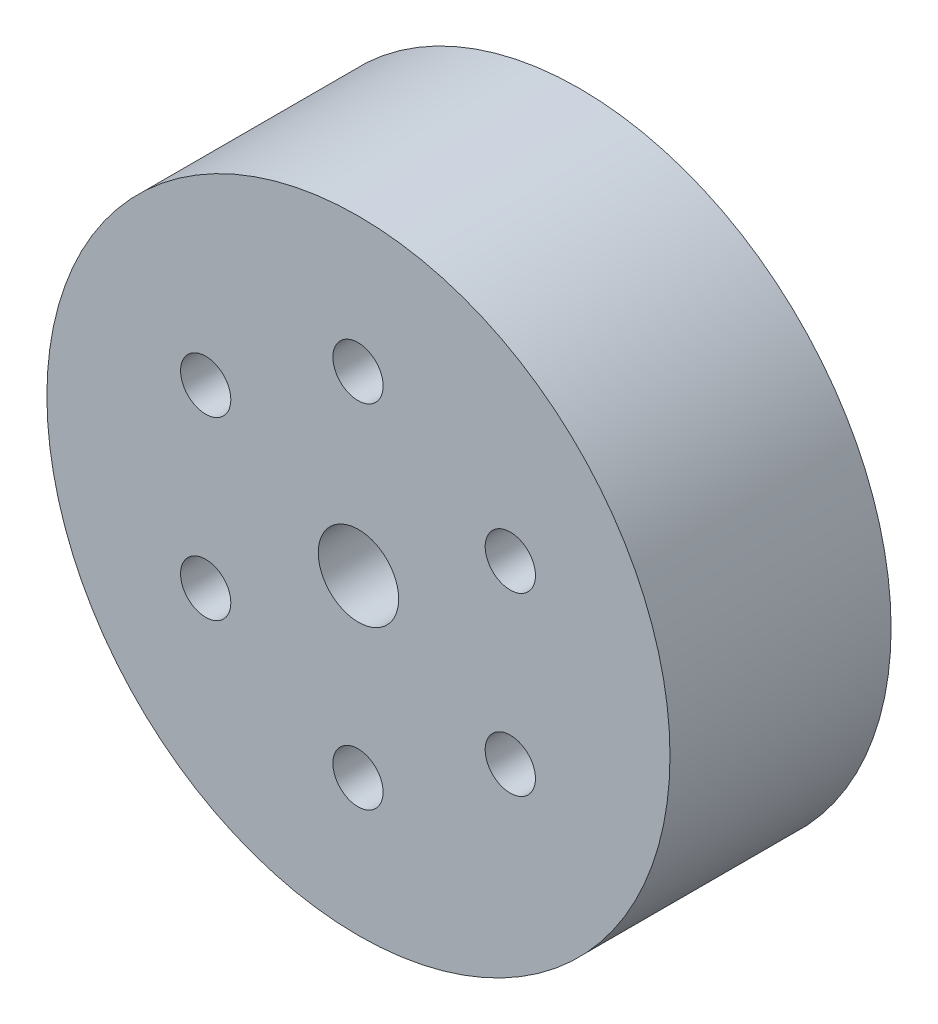
ISO-10303-21;
HEADER;
FILE_DESCRIPTION(('STEP AP214'),'2;1');
FILE_NAME('part.step','',(''),(''),'','','');
FILE_SCHEMA(('AUTOMOTIVE_DESIGN { 1 0 10303 214 1 1 1 1 }'));
ENDSEC;
DATA;
#1=APPLICATION_CONTEXT('core data for automotive mechanical design processes');
#2=APPLICATION_PROTOCOL_DEFINITION('international standard','automotive_design',2000,#1);
#3=PRODUCT_CONTEXT('',#1,'mechanical');
#4=PRODUCT('Part','Part','',(#3));
#5=PRODUCT_RELATED_PRODUCT_CATEGORY('part','',(#4));
#6=PRODUCT_DEFINITION_FORMATION('','',#4);
#7=PRODUCT_DEFINITION_CONTEXT('part definition',#1,'design');
#8=PRODUCT_DEFINITION('design','',#6,#7);
#9=PRODUCT_DEFINITION_SHAPE('','',#8);
#10=(LENGTH_UNIT() NAMED_UNIT(*) SI_UNIT(.MILLI.,.METRE.));
#11=(NAMED_UNIT(*) PLANE_ANGLE_UNIT() SI_UNIT($,.RADIAN.));
#12=(NAMED_UNIT(*) SI_UNIT($,.STERADIAN.) SOLID_ANGLE_UNIT());
#13=UNCERTAINTY_MEASURE_WITH_UNIT(LENGTH_MEASURE(1.E-05),#10,'distance_accuracy_value','');
#14=(GEOMETRIC_REPRESENTATION_CONTEXT(3) GLOBAL_UNCERTAINTY_ASSIGNED_CONTEXT((#13)) GLOBAL_UNIT_ASSIGNED_CONTEXT((#10,
#11,#12)) REPRESENTATION_CONTEXT('',''));
#15=CARTESIAN_POINT('',(0.,0.,0.));
#16=DIRECTION('',(0.,0.,1.));
#17=DIRECTION('',(1.,0.,0.));
#18=AXIS2_PLACEMENT_3D('',#15,#16,#17);
#19=CARTESIAN_POINT('',(0.,0.,11.));
#20=DIRECTION('',(0.,0.,-1.));
#21=DIRECTION('',(-1.,0.,0.));
#22=AXIS2_PLACEMENT_3D('',#19,#20,#21);
#23=CYLINDRICAL_SURFACE('',#22,15.5);
#24=CARTESIAN_POINT('',(0.,0.,11.));
#25=DIRECTION('',(0.,0.,1.));
#26=DIRECTION('',(1.,0.,0.));
#27=AXIS2_PLACEMENT_3D('',#24,#25,#26);
#28=CIRCLE('',#27,15.5);
#29=CARTESIAN_POINT('',(15.5,0.,11.));
#30=VERTEX_POINT('',#29);
#31=EDGE_CURVE('E10',#30,#30,#28,.T.);
#32=ORIENTED_EDGE('',*,*,#31,.F.);
#33=EDGE_LOOP('',(#32));
#34=FACE_BOUND('',#33,.T.);
#35=CARTESIAN_POINT('',(0.,0.,0.));
#36=DIRECTION('',(0.,0.,1.));
#37=DIRECTION('',(1.,0.,0.));
#38=AXIS2_PLACEMENT_3D('',#35,#36,#37);
#39=CIRCLE('',#38,15.5);
#40=CARTESIAN_POINT('',(15.5,0.,0.));
#41=VERTEX_POINT('',#40);
#42=EDGE_CURVE('E40',#41,#41,#39,.T.);
#43=ORIENTED_EDGE('',*,*,#42,.T.);
#44=EDGE_LOOP('',(#43));
#45=FACE_BOUND('',#44,.T.);
#46=ADVANCED_FACE('F37',(#34,#45),#23,.T.);
#47=CARTESIAN_POINT('',(0.,0.,11.));
#48=DIRECTION('',(0.,0.,1.));
#49=DIRECTION('',(1.,0.,0.));
#50=AXIS2_PLACEMENT_3D('',#47,#48,#49);
#51=PLANE('',#50);
#52=CARTESIAN_POINT('',(7.55529817483224,4.41361184172063,11.));
#53=DIRECTION('',(0.,0.,1.));
#54=DIRECTION('',(1.,0.,0.));
#55=AXIS2_PLACEMENT_3D('',#52,#53,#54);
#56=CIRCLE('',#55,1.25);
#57=CARTESIAN_POINT('',(8.80529817483224,4.41361184172063,11.));
#58=VERTEX_POINT('',#57);
#59=EDGE_CURVE('E84',#58,#58,#56,.T.);
#60=ORIENTED_EDGE('',*,*,#59,.F.);
#61=EDGE_LOOP('',(#60));
#62=FACE_BOUND('',#61,.T.);
#63=CARTESIAN_POINT('',(7.55507908258958,-4.33638815553643,11.));
#64=DIRECTION('',(0.,0.,1.));
#65=DIRECTION('',(1.,0.,0.));
#66=AXIS2_PLACEMENT_3D('',#63,#64,#65);
#67=CIRCLE('',#66,1.24999999999992);
#68=CARTESIAN_POINT('',(8.8050790825895,-4.33638815553643,11.));
#69=VERTEX_POINT('',#68);
#70=EDGE_CURVE('E76',#69,#69,#67,.T.);
#71=ORIENTED_EDGE('',*,*,#70,.F.);
#72=EDGE_LOOP('',(#71));
#73=FACE_BOUND('',#72,.T.);
#74=CARTESIAN_POINT('',(-0.0227527442701449,-8.71119841471704,11.));
#75=DIRECTION('',(0.,0.,1.));
#76=DIRECTION('',(1.,0.,0.));
#77=AXIS2_PLACEMENT_3D('',#74,#75,#76);
#78=CIRCLE('',#77,1.24999999999966);
#79=CARTESIAN_POINT('',(1.22724725572951,-8.71119841471704,11.));
#80=VERTEX_POINT('',#79);
#81=EDGE_CURVE('E68',#80,#80,#78,.T.);
#82=ORIENTED_EDGE('',*,*,#81,.F.);
#83=EDGE_LOOP('',(#82));
#84=FACE_BOUND('',#83,.T.);
#85=CARTESIAN_POINT('',(-7.6003654788872,-4.33600867664058,11.));
#86=DIRECTION('',(0.,0.,1.));
#87=DIRECTION('',(1.,0.,0.));
#88=AXIS2_PLACEMENT_3D('',#85,#86,#87);
#89=CIRCLE('',#88,1.24999999999946);
#90=CARTESIAN_POINT('',(-6.35036547888773,-4.33600867664058,11.));
#91=VERTEX_POINT('',#90);
#92=EDGE_CURVE('E59',#91,#91,#89,.T.);
#93=ORIENTED_EDGE('',*,*,#92,.F.);
#94=EDGE_LOOP('',(#93));
#95=FACE_BOUND('',#94,.T.);
#96=CARTESIAN_POINT('',(-7.60014638664453,4.41399132061648,11.));
#97=DIRECTION('',(0.,0.,1.));
#98=DIRECTION('',(1.,0.,0.));
#99=AXIS2_PLACEMENT_3D('',#96,#97,#98);
#100=CIRCLE('',#99,1.24999999999955);
#101=CARTESIAN_POINT('',(-6.35014638664498,4.41399132061648,11.));
#102=VERTEX_POINT('',#101);
#103=EDGE_CURVE('E99',#102,#102,#100,.T.);
#104=ORIENTED_EDGE('',*,*,#103,.F.);
#105=EDGE_LOOP('',(#104));
#106=FACE_BOUND('',#105,.T.);
#107=CARTESIAN_POINT('',(-0.0223145597848123,8.78880157979709,11.));
#108=DIRECTION('',(0.,0.,1.));
#109=DIRECTION('',(1.,0.,0.));
#110=AXIS2_PLACEMENT_3D('',#107,#108,#109);
#111=CIRCLE('',#110,1.24999999999982);
#112=CARTESIAN_POINT('',(1.227685440215,8.78880157979709,11.));
#113=VERTEX_POINT('',#112);
#114=EDGE_CURVE('E91',#113,#113,#111,.T.);
#115=ORIENTED_EDGE('',*,*,#114,.F.);
#116=EDGE_LOOP('',(#115));
#117=FACE_BOUND('',#116,.T.);
#118=CARTESIAN_POINT('',(0.,0.,11.));
#119=DIRECTION('',(0.,0.,1.));
#120=DIRECTION('',(1.,0.,0.));
#121=AXIS2_PLACEMENT_3D('',#118,#119,#120);
#122=CIRCLE('',#121,2.);
#123=CARTESIAN_POINT('',(2.,0.,11.));
#124=VERTEX_POINT('',#123);
#125=EDGE_CURVE('E51',#124,#124,#122,.T.);
#126=ORIENTED_EDGE('',*,*,#125,.F.);
#127=EDGE_LOOP('',(#126));
#128=FACE_BOUND('',#127,.T.);
#129=ORIENTED_EDGE('',*,*,#31,.T.);
#130=EDGE_LOOP('',(#129));
#131=FACE_BOUND('',#130,.T.);
#132=ADVANCED_FACE('F118',(#62,#73,#84,#95,#106,#117,#128,#131),#51,.T.);
#133=CARTESIAN_POINT('',(0.,0.,0.));
#134=DIRECTION('',(0.,0.,1.));
#135=DIRECTION('',(1.,0.,0.));
#136=AXIS2_PLACEMENT_3D('',#133,#134,#135);
#137=PLANE('',#136);
#138=CARTESIAN_POINT('',(7.55529817483224,4.41361184172063,0.));
#139=DIRECTION('',(0.,0.,1.));
#140=DIRECTION('',(1.,0.,0.));
#141=AXIS2_PLACEMENT_3D('',#138,#139,#140);
#142=CIRCLE('',#141,1.25);
#143=CARTESIAN_POINT('',(8.80529817483224,4.41361184172063,0.));
#144=VERTEX_POINT('',#143);
#145=EDGE_CURVE('E55',#144,#144,#142,.T.);
#146=ORIENTED_EDGE('',*,*,#145,.T.);
#147=EDGE_LOOP('',(#146));
#148=FACE_BOUND('',#147,.T.);
#149=CARTESIAN_POINT('',(7.55507908258958,-4.33638815553643,0.));
#150=DIRECTION('',(0.,0.,1.));
#151=DIRECTION('',(1.,0.,0.));
#152=AXIS2_PLACEMENT_3D('',#149,#150,#151);
#153=CIRCLE('',#152,1.24999999999992);
#154=CARTESIAN_POINT('',(8.8050790825895,-4.33638815553643,0.));
#155=VERTEX_POINT('',#154);
#156=EDGE_CURVE('E80',#155,#155,#153,.T.);
#157=ORIENTED_EDGE('',*,*,#156,.T.);
#158=EDGE_LOOP('',(#157));
#159=FACE_BOUND('',#158,.T.);
#160=CARTESIAN_POINT('',(-0.0227527442701449,-8.71119841471704,0.));
#161=DIRECTION('',(0.,0.,1.));
#162=DIRECTION('',(1.,0.,0.));
#163=AXIS2_PLACEMENT_3D('',#160,#161,#162);
#164=CIRCLE('',#163,1.24999999999966);
#165=CARTESIAN_POINT('',(1.22724725572951,-8.71119841471704,0.));
#166=VERTEX_POINT('',#165);
#167=EDGE_CURVE('E72',#166,#166,#164,.T.);
#168=ORIENTED_EDGE('',*,*,#167,.T.);
#169=EDGE_LOOP('',(#168));
#170=FACE_BOUND('',#169,.T.);
#171=CARTESIAN_POINT('',(-7.6003654788872,-4.33600867664058,0.));
#172=DIRECTION('',(0.,0.,1.));
#173=DIRECTION('',(1.,0.,0.));
#174=AXIS2_PLACEMENT_3D('',#171,#172,#173);
#175=CIRCLE('',#174,1.24999999999946);
#176=CARTESIAN_POINT('',(-6.35036547888773,-4.33600867664058,0.));
#177=VERTEX_POINT('',#176);
#178=EDGE_CURVE('E63',#177,#177,#175,.T.);
#179=ORIENTED_EDGE('',*,*,#178,.T.);
#180=EDGE_LOOP('',(#179));
#181=FACE_BOUND('',#180,.T.);
#182=CARTESIAN_POINT('',(-7.60014638664453,4.41399132061648,0.));
#183=DIRECTION('',(0.,0.,1.));
#184=DIRECTION('',(1.,0.,0.));
#185=AXIS2_PLACEMENT_3D('',#182,#183,#184);
#186=CIRCLE('',#185,1.24999999999955);
#187=CARTESIAN_POINT('',(-6.35014638664498,4.41399132061648,0.));
#188=VERTEX_POINT('',#187);
#189=EDGE_CURVE('E64',#188,#188,#186,.T.);
#190=ORIENTED_EDGE('',*,*,#189,.T.);
#191=EDGE_LOOP('',(#190));
#192=FACE_BOUND('',#191,.T.);
#193=CARTESIAN_POINT('',(-0.0223145597848123,8.78880157979709,0.));
#194=DIRECTION('',(0.,0.,1.));
#195=DIRECTION('',(1.,0.,0.));
#196=AXIS2_PLACEMENT_3D('',#193,#194,#195);
#197=CIRCLE('',#196,1.24999999999982);
#198=CARTESIAN_POINT('',(1.227685440215,8.78880157979709,0.));
#199=VERTEX_POINT('',#198);
#200=EDGE_CURVE('E95',#199,#199,#197,.T.);
#201=ORIENTED_EDGE('',*,*,#200,.T.);
#202=EDGE_LOOP('',(#201));
#203=FACE_BOUND('',#202,.T.);
#204=CARTESIAN_POINT('',(0.,0.,0.));
#205=DIRECTION('',(0.,0.,1.));
#206=DIRECTION('',(1.,0.,0.));
#207=AXIS2_PLACEMENT_3D('',#204,#205,#206);
#208=CIRCLE('',#207,2.);
#209=CARTESIAN_POINT('',(2.,0.,0.));
#210=VERTEX_POINT('',#209);
#211=EDGE_CURVE('E49',#210,#210,#208,.T.);
#212=ORIENTED_EDGE('',*,*,#211,.T.);
#213=EDGE_LOOP('',(#212));
#214=FACE_BOUND('',#213,.T.);
#215=ORIENTED_EDGE('',*,*,#42,.F.);
#216=EDGE_LOOP('',(#215));
#217=FACE_BOUND('',#216,.T.);
#218=ADVANCED_FACE('F107',(#148,#159,#170,#181,#192,#203,#214,#217),#137,.F.);
#219=CARTESIAN_POINT('',(0.,0.,0.));
#220=DIRECTION('',(0.,0.,1.));
#221=DIRECTION('',(1.,0.,0.));
#222=AXIS2_PLACEMENT_3D('',#219,#220,#221);
#223=CYLINDRICAL_SURFACE('',#222,2.);
#224=ORIENTED_EDGE('',*,*,#211,.F.);
#225=EDGE_LOOP('',(#224));
#226=FACE_BOUND('',#225,.T.);
#227=ORIENTED_EDGE('',*,*,#125,.T.);
#228=EDGE_LOOP('',(#227));
#229=FACE_BOUND('',#228,.T.);
#230=ADVANCED_FACE('F127',(#226,#229),#223,.F.);
#231=CARTESIAN_POINT('',(-0.0223145597848123,8.78880157979709,0.));
#232=DIRECTION('',(0.,0.,1.));
#233=DIRECTION('',(1.,0.,0.));
#234=AXIS2_PLACEMENT_3D('',#231,#232,#233);
#235=CYLINDRICAL_SURFACE('',#234,1.24999999999982);
#236=ORIENTED_EDGE('',*,*,#200,.F.);
#237=EDGE_LOOP('',(#236));
#238=FACE_BOUND('',#237,.T.);
#239=ORIENTED_EDGE('',*,*,#114,.T.);
#240=EDGE_LOOP('',(#239));
#241=FACE_BOUND('',#240,.T.);
#242=ADVANCED_FACE('F114',(#238,#241),#235,.F.);
#243=CARTESIAN_POINT('',(-7.60014638664453,4.41399132061648,0.));
#244=DIRECTION('',(0.,0.,1.));
#245=DIRECTION('',(1.,0.,0.));
#246=AXIS2_PLACEMENT_3D('',#243,#244,#245);
#247=CYLINDRICAL_SURFACE('',#246,1.24999999999955);
#248=ORIENTED_EDGE('',*,*,#189,.F.);
#249=EDGE_LOOP('',(#248));
#250=FACE_BOUND('',#249,.T.);
#251=ORIENTED_EDGE('',*,*,#103,.T.);
#252=EDGE_LOOP('',(#251));
#253=FACE_BOUND('',#252,.T.);
#254=ADVANCED_FACE('F110',(#250,#253),#247,.F.);
#255=CARTESIAN_POINT('',(-7.6003654788872,-4.33600867664058,0.));
#256=DIRECTION('',(0.,0.,1.));
#257=DIRECTION('',(1.,0.,0.));
#258=AXIS2_PLACEMENT_3D('',#255,#256,#257);
#259=CYLINDRICAL_SURFACE('',#258,1.24999999999946);
#260=ORIENTED_EDGE('',*,*,#178,.F.);
#261=EDGE_LOOP('',(#260));
#262=FACE_BOUND('',#261,.T.);
#263=ORIENTED_EDGE('',*,*,#92,.T.);
#264=EDGE_LOOP('',(#263));
#265=FACE_BOUND('',#264,.T.);
#266=ADVANCED_FACE('F113',(#262,#265),#259,.F.);
#267=CARTESIAN_POINT('',(-0.0227527442701449,-8.71119841471704,0.));
#268=DIRECTION('',(0.,0.,1.));
#269=DIRECTION('',(1.,0.,0.));
#270=AXIS2_PLACEMENT_3D('',#267,#268,#269);
#271=CYLINDRICAL_SURFACE('',#270,1.24999999999966);
#272=ORIENTED_EDGE('',*,*,#167,.F.);
#273=EDGE_LOOP('',(#272));
#274=FACE_BOUND('',#273,.T.);
#275=ORIENTED_EDGE('',*,*,#81,.T.);
#276=EDGE_LOOP('',(#275));
#277=FACE_BOUND('',#276,.T.);
#278=ADVANCED_FACE('F180',(#274,#277),#271,.F.);
#279=CARTESIAN_POINT('',(7.55507908258958,-4.33638815553643,0.));
#280=DIRECTION('',(0.,0.,1.));
#281=DIRECTION('',(1.,0.,0.));
#282=AXIS2_PLACEMENT_3D('',#279,#280,#281);
#283=CYLINDRICAL_SURFACE('',#282,1.24999999999992);
#284=ORIENTED_EDGE('',*,*,#156,.F.);
#285=EDGE_LOOP('',(#284));
#286=FACE_BOUND('',#285,.T.);
#287=ORIENTED_EDGE('',*,*,#70,.T.);
#288=EDGE_LOOP('',(#287));
#289=FACE_BOUND('',#288,.T.);
#290=ADVANCED_FACE('F189',(#286,#289),#283,.F.);
#291=CARTESIAN_POINT('',(7.55529817483224,4.41361184172063,0.));
#292=DIRECTION('',(0.,0.,1.));
#293=DIRECTION('',(1.,0.,0.));
#294=AXIS2_PLACEMENT_3D('',#291,#292,#293);
#295=CYLINDRICAL_SURFACE('',#294,1.25);
#296=ORIENTED_EDGE('',*,*,#145,.F.);
#297=EDGE_LOOP('',(#296));
#298=FACE_BOUND('',#297,.T.);
#299=ORIENTED_EDGE('',*,*,#59,.T.);
#300=EDGE_LOOP('',(#299));
#301=FACE_BOUND('',#300,.T.);
#302=ADVANCED_FACE('F199',(#298,#301),#295,.F.);
#303=CLOSED_SHELL('',(#46,#132,#218,#230,#242,#254,#266,#278,#290,#302));
#304=MANIFOLD_SOLID_BREP('B2',#303);
#305=ADVANCED_BREP_SHAPE_REPRESENTATION('',(#18,#304),#14);
#306=SHAPE_DEFINITION_REPRESENTATION(#9,#305);
ENDSEC;
END-ISO-10303-21;
